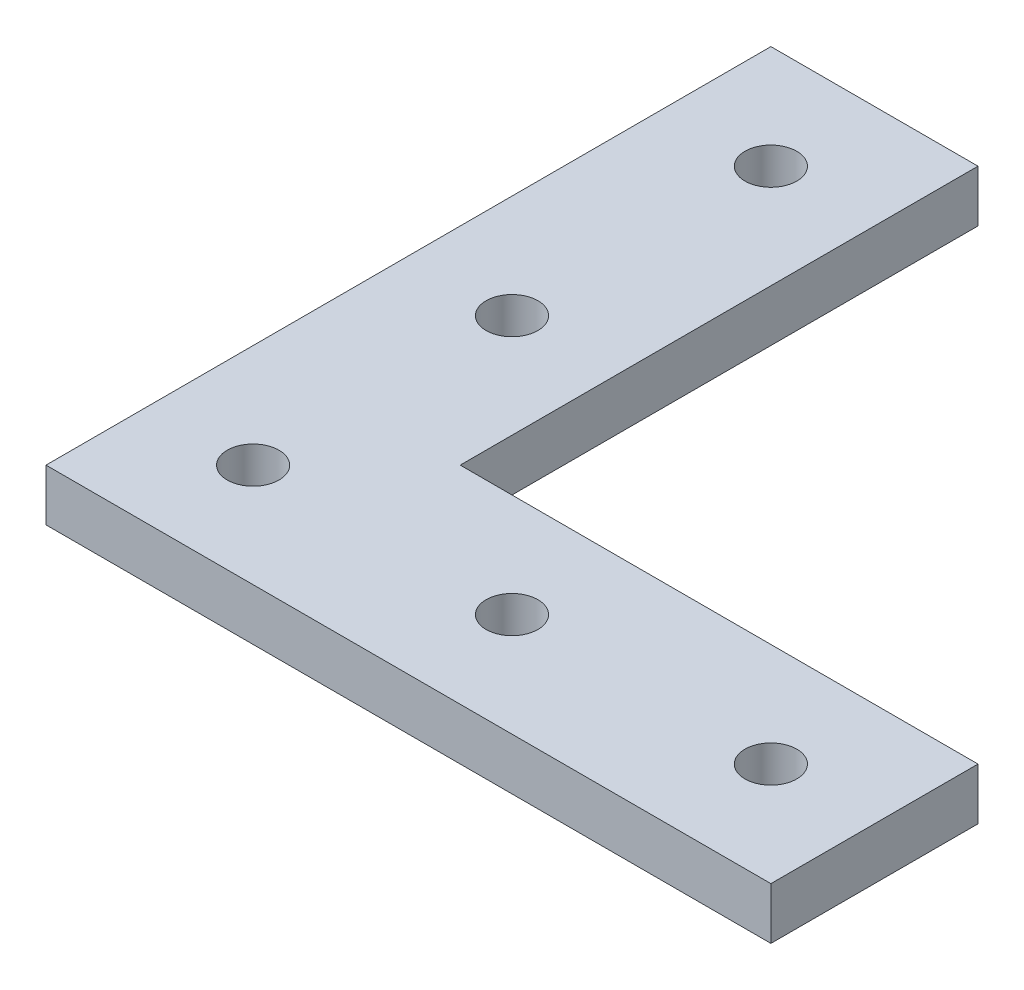
ISO-10303-21;
HEADER;
FILE_DESCRIPTION(('STEP AP214'),'2;1');
FILE_NAME('part.step','',(''),(''),'','','');
FILE_SCHEMA(('AUTOMOTIVE_DESIGN { 1 0 10303 214 1 1 1 1 }'));
ENDSEC;
DATA;
#1=APPLICATION_CONTEXT('core data for automotive mechanical design processes');
#2=APPLICATION_PROTOCOL_DEFINITION('international standard','automotive_design',2000,#1);
#3=PRODUCT_CONTEXT('',#1,'mechanical');
#4=PRODUCT('Part','Part','',(#3));
#5=PRODUCT_RELATED_PRODUCT_CATEGORY('part','',(#4));
#6=PRODUCT_DEFINITION_FORMATION('','',#4);
#7=PRODUCT_DEFINITION_CONTEXT('part definition',#1,'design');
#8=PRODUCT_DEFINITION('design','',#6,#7);
#9=PRODUCT_DEFINITION_SHAPE('','',#8);
#10=(LENGTH_UNIT() NAMED_UNIT(*) SI_UNIT(.MILLI.,.METRE.));
#11=(NAMED_UNIT(*) PLANE_ANGLE_UNIT() SI_UNIT($,.RADIAN.));
#12=(NAMED_UNIT(*) SI_UNIT($,.STERADIAN.) SOLID_ANGLE_UNIT());
#13=UNCERTAINTY_MEASURE_WITH_UNIT(LENGTH_MEASURE(1.E-05),#10,'distance_accuracy_value','');
#14=(GEOMETRIC_REPRESENTATION_CONTEXT(3) GLOBAL_UNCERTAINTY_ASSIGNED_CONTEXT((#13)) GLOBAL_UNIT_ASSIGNED_CONTEXT((#10,
#11,#12)) REPRESENTATION_CONTEXT('',''));
#15=CARTESIAN_POINT('',(0.,0.,0.));
#16=DIRECTION('',(0.,0.,1.));
#17=DIRECTION('',(1.,0.,0.));
#18=AXIS2_PLACEMENT_3D('',#15,#16,#17);
#19=CARTESIAN_POINT('',(70.,5.,0.));
#20=DIRECTION('',(0.,0.,-1.));
#21=DIRECTION('',(-1.,0.,0.));
#22=AXIS2_PLACEMENT_3D('',#19,#20,#21);
#23=PLANE('',#22);
#24=DIRECTION('',(1.,0.,0.));
#25=VECTOR('',#24,1.);
#26=CARTESIAN_POINT('',(70.,0.,0.));
#27=LINE('',#26,#25);
#28=CARTESIAN_POINT('',(0.,0.,0.));
#29=VERTEX_POINT('',#28);
#30=CARTESIAN_POINT('',(70.,0.,0.));
#31=VERTEX_POINT('',#30);
#32=EDGE_CURVE('E128',#29,#31,#27,.T.);
#33=ORIENTED_EDGE('',*,*,#32,.T.);
#34=DIRECTION('',(0.,-1.,0.));
#35=VECTOR('',#34,1.);
#36=CARTESIAN_POINT('',(70.,5.,0.));
#37=LINE('',#36,#35);
#38=CARTESIAN_POINT('',(70.,5.,0.));
#39=VERTEX_POINT('',#38);
#40=EDGE_CURVE('E11',#39,#31,#37,.T.);
#41=ORIENTED_EDGE('',*,*,#40,.F.);
#42=DIRECTION('',(1.,0.,0.));
#43=VECTOR('',#42,1.);
#44=CARTESIAN_POINT('',(70.,5.,0.));
#45=LINE('',#44,#43);
#46=CARTESIAN_POINT('',(0.,5.,0.));
#47=VERTEX_POINT('',#46);
#48=EDGE_CURVE('E145',#47,#39,#45,.T.);
#49=ORIENTED_EDGE('',*,*,#48,.F.);
#50=DIRECTION('',(0.,-1.,0.));
#51=VECTOR('',#50,1.);
#52=CARTESIAN_POINT('',(0.,5.,0.));
#53=LINE('',#52,#51);
#54=EDGE_CURVE('E124',#47,#29,#53,.T.);
#55=ORIENTED_EDGE('',*,*,#54,.T.);
#56=EDGE_LOOP('',(#33,#41,#49,#55));
#57=FACE_BOUND('',#56,.T.);
#58=ADVANCED_FACE('F39',(#57),#23,.F.);
#59=CARTESIAN_POINT('',(70.,5.,-20.));
#60=DIRECTION('',(-1.,0.,0.));
#61=DIRECTION('',(0.,0.,1.));
#62=AXIS2_PLACEMENT_3D('',#59,#60,#61);
#63=PLANE('',#62);
#64=DIRECTION('',(0.,0.,-1.));
#65=VECTOR('',#64,1.);
#66=CARTESIAN_POINT('',(70.,0.,-20.));
#67=LINE('',#66,#65);
#68=CARTESIAN_POINT('',(70.,0.,-20.));
#69=VERTEX_POINT('',#68);
#70=EDGE_CURVE('E132',#31,#69,#67,.T.);
#71=ORIENTED_EDGE('',*,*,#70,.T.);
#72=DIRECTION('',(0.,-1.,0.));
#73=VECTOR('',#72,1.);
#74=CARTESIAN_POINT('',(70.,5.,-20.));
#75=LINE('',#74,#73);
#76=CARTESIAN_POINT('',(70.,5.,-20.));
#77=VERTEX_POINT('',#76);
#78=EDGE_CURVE('E48',#77,#69,#75,.T.);
#79=ORIENTED_EDGE('',*,*,#78,.F.);
#80=DIRECTION('',(0.,0.,-1.));
#81=VECTOR('',#80,1.);
#82=CARTESIAN_POINT('',(70.,5.,-20.));
#83=LINE('',#82,#81);
#84=EDGE_CURVE('E93',#39,#77,#83,.T.);
#85=ORIENTED_EDGE('',*,*,#84,.F.);
#86=ORIENTED_EDGE('',*,*,#40,.T.);
#87=EDGE_LOOP('',(#71,#79,#85,#86));
#88=FACE_BOUND('',#87,.T.);
#89=ADVANCED_FACE('F174',(#88),#63,.F.);
#90=CARTESIAN_POINT('',(20.,5.,-20.));
#91=DIRECTION('',(0.,0.,1.));
#92=DIRECTION('',(1.,0.,0.));
#93=AXIS2_PLACEMENT_3D('',#90,#91,#92);
#94=PLANE('',#93);
#95=DIRECTION('',(-1.,0.,0.));
#96=VECTOR('',#95,1.);
#97=CARTESIAN_POINT('',(20.,0.,-20.));
#98=LINE('',#97,#96);
#99=CARTESIAN_POINT('',(20.,0.,-20.));
#100=VERTEX_POINT('',#99);
#101=EDGE_CURVE('E136',#69,#100,#98,.T.);
#102=ORIENTED_EDGE('',*,*,#101,.T.);
#103=DIRECTION('',(0.,-1.,0.));
#104=VECTOR('',#103,1.);
#105=CARTESIAN_POINT('',(20.,5.,-20.));
#106=LINE('',#105,#104);
#107=CARTESIAN_POINT('',(20.,5.,-20.));
#108=VERTEX_POINT('',#107);
#109=EDGE_CURVE('E117',#108,#100,#106,.T.);
#110=ORIENTED_EDGE('',*,*,#109,.F.);
#111=DIRECTION('',(-1.,0.,0.));
#112=VECTOR('',#111,1.);
#113=CARTESIAN_POINT('',(20.,5.,-20.));
#114=LINE('',#113,#112);
#115=EDGE_CURVE('E106',#77,#108,#114,.T.);
#116=ORIENTED_EDGE('',*,*,#115,.F.);
#117=ORIENTED_EDGE('',*,*,#78,.T.);
#118=EDGE_LOOP('',(#102,#110,#116,#117));
#119=FACE_BOUND('',#118,.T.);
#120=ADVANCED_FACE('F155',(#119),#94,.F.);
#121=CARTESIAN_POINT('',(20.,5.,-70.));
#122=DIRECTION('',(-1.,0.,0.));
#123=DIRECTION('',(0.,0.,1.));
#124=AXIS2_PLACEMENT_3D('',#121,#122,#123);
#125=PLANE('',#124);
#126=DIRECTION('',(0.,0.,-1.));
#127=VECTOR('',#126,1.);
#128=CARTESIAN_POINT('',(20.,0.,-70.));
#129=LINE('',#128,#127);
#130=CARTESIAN_POINT('',(20.,0.,-70.));
#131=VERTEX_POINT('',#130);
#132=EDGE_CURVE('E115',#100,#131,#129,.T.);
#133=ORIENTED_EDGE('',*,*,#132,.T.);
#134=DIRECTION('',(0.,-1.,0.));
#135=VECTOR('',#134,1.);
#136=CARTESIAN_POINT('',(20.,5.,-70.));
#137=LINE('',#136,#135);
#138=CARTESIAN_POINT('',(20.,5.,-70.));
#139=VERTEX_POINT('',#138);
#140=EDGE_CURVE('E112',#139,#131,#137,.T.);
#141=ORIENTED_EDGE('',*,*,#140,.F.);
#142=DIRECTION('',(0.,0.,-1.));
#143=VECTOR('',#142,1.);
#144=CARTESIAN_POINT('',(20.,5.,-70.));
#145=LINE('',#144,#143);
#146=EDGE_CURVE('E100',#108,#139,#145,.T.);
#147=ORIENTED_EDGE('',*,*,#146,.F.);
#148=ORIENTED_EDGE('',*,*,#109,.T.);
#149=EDGE_LOOP('',(#133,#141,#147,#148));
#150=FACE_BOUND('',#149,.T.);
#151=ADVANCED_FACE('F113',(#150),#125,.F.);
#152=CARTESIAN_POINT('',(0.,5.,-70.));
#153=DIRECTION('',(0.,0.,1.));
#154=DIRECTION('',(1.,0.,0.));
#155=AXIS2_PLACEMENT_3D('',#152,#153,#154);
#156=PLANE('',#155);
#157=DIRECTION('',(-1.,0.,0.));
#158=VECTOR('',#157,1.);
#159=CARTESIAN_POINT('',(0.,0.,-70.));
#160=LINE('',#159,#158);
#161=CARTESIAN_POINT('',(0.,0.,-70.));
#162=VERTEX_POINT('',#161);
#163=EDGE_CURVE('E79',#131,#162,#160,.T.);
#164=ORIENTED_EDGE('',*,*,#163,.T.);
#165=DIRECTION('',(0.,-1.,0.));
#166=VECTOR('',#165,1.);
#167=CARTESIAN_POINT('',(0.,5.,-70.));
#168=LINE('',#167,#166);
#169=CARTESIAN_POINT('',(0.,5.,-70.));
#170=VERTEX_POINT('',#169);
#171=EDGE_CURVE('E118',#170,#162,#168,.T.);
#172=ORIENTED_EDGE('',*,*,#171,.F.);
#173=DIRECTION('',(-1.,0.,0.));
#174=VECTOR('',#173,1.);
#175=CARTESIAN_POINT('',(0.,5.,-70.));
#176=LINE('',#175,#174);
#177=EDGE_CURVE('E104',#139,#170,#176,.T.);
#178=ORIENTED_EDGE('',*,*,#177,.F.);
#179=ORIENTED_EDGE('',*,*,#140,.T.);
#180=EDGE_LOOP('',(#164,#172,#178,#179));
#181=FACE_BOUND('',#180,.T.);
#182=ADVANCED_FACE('F120',(#181),#156,.F.);
#183=CARTESIAN_POINT('',(0.,5.,0.));
#184=DIRECTION('',(1.,0.,0.));
#185=DIRECTION('',(0.,0.,-1.));
#186=AXIS2_PLACEMENT_3D('',#183,#184,#185);
#187=PLANE('',#186);
#188=DIRECTION('',(0.,0.,1.));
#189=VECTOR('',#188,1.);
#190=CARTESIAN_POINT('',(0.,0.,0.));
#191=LINE('',#190,#189);
#192=EDGE_CURVE('E85',#162,#29,#191,.T.);
#193=ORIENTED_EDGE('',*,*,#192,.T.);
#194=ORIENTED_EDGE('',*,*,#54,.F.);
#195=DIRECTION('',(0.,0.,1.));
#196=VECTOR('',#195,1.);
#197=CARTESIAN_POINT('',(0.,5.,0.));
#198=LINE('',#197,#196);
#199=EDGE_CURVE('E56',#170,#47,#198,.T.);
#200=ORIENTED_EDGE('',*,*,#199,.F.);
#201=ORIENTED_EDGE('',*,*,#171,.T.);
#202=EDGE_LOOP('',(#193,#194,#200,#201));
#203=FACE_BOUND('',#202,.T.);
#204=ADVANCED_FACE('F162',(#203),#187,.F.);
#205=CARTESIAN_POINT('',(0.,5.,0.));
#206=DIRECTION('',(0.,-1.,0.));
#207=DIRECTION('',(0.,0.,-1.));
#208=AXIS2_PLACEMENT_3D('',#205,#206,#207);
#209=PLANE('',#208);
#210=CARTESIAN_POINT('',(10.,5.,-60.));
#211=DIRECTION('',(0.,1.,0.));
#212=DIRECTION('',(0.,0.,1.));
#213=AXIS2_PLACEMENT_3D('',#210,#211,#212);
#214=CIRCLE('',#213,2.5);
#215=CARTESIAN_POINT('',(10.,5.,-57.5));
#216=VERTEX_POINT('',#215);
#217=EDGE_CURVE('E269',#216,#216,#214,.T.);
#218=ORIENTED_EDGE('',*,*,#217,.F.);
#219=EDGE_LOOP('',(#218));
#220=FACE_BOUND('',#219,.T.);
#221=CARTESIAN_POINT('',(10.,5.,-35.));
#222=DIRECTION('',(0.,1.,0.));
#223=DIRECTION('',(0.,0.,1.));
#224=AXIS2_PLACEMENT_3D('',#221,#222,#223);
#225=CIRCLE('',#224,2.5);
#226=CARTESIAN_POINT('',(10.,5.,-32.5));
#227=VERTEX_POINT('',#226);
#228=EDGE_CURVE('E277',#227,#227,#225,.T.);
#229=ORIENTED_EDGE('',*,*,#228,.F.);
#230=EDGE_LOOP('',(#229));
#231=FACE_BOUND('',#230,.T.);
#232=CARTESIAN_POINT('',(10.,5.,-10.));
#233=DIRECTION('',(0.,1.,0.));
#234=DIRECTION('',(0.,0.,1.));
#235=AXIS2_PLACEMENT_3D('',#232,#233,#234);
#236=CIRCLE('',#235,2.5);
#237=CARTESIAN_POINT('',(10.,5.,-7.5));
#238=VERTEX_POINT('',#237);
#239=EDGE_CURVE('E287',#238,#238,#236,.T.);
#240=ORIENTED_EDGE('',*,*,#239,.F.);
#241=EDGE_LOOP('',(#240));
#242=FACE_BOUND('',#241,.T.);
#243=CARTESIAN_POINT('',(35.,5.,-10.));
#244=DIRECTION('',(0.,1.,0.));
#245=DIRECTION('',(0.,0.,1.));
#246=AXIS2_PLACEMENT_3D('',#243,#244,#245);
#247=CIRCLE('',#246,2.5);
#248=CARTESIAN_POINT('',(35.,5.,-7.5));
#249=VERTEX_POINT('',#248);
#250=EDGE_CURVE('E295',#249,#249,#247,.T.);
#251=ORIENTED_EDGE('',*,*,#250,.F.);
#252=EDGE_LOOP('',(#251));
#253=FACE_BOUND('',#252,.T.);
#254=CARTESIAN_POINT('',(60.,5.,-10.));
#255=DIRECTION('',(0.,1.,0.));
#256=DIRECTION('',(0.,0.,1.));
#257=AXIS2_PLACEMENT_3D('',#254,#255,#256);
#258=CIRCLE('',#257,2.49999999999999);
#259=CARTESIAN_POINT('',(60.,5.,-7.50000000000001));
#260=VERTEX_POINT('',#259);
#261=EDGE_CURVE('E303',#260,#260,#258,.T.);
#262=ORIENTED_EDGE('',*,*,#261,.F.);
#263=EDGE_LOOP('',(#262));
#264=FACE_BOUND('',#263,.T.);
#265=ORIENTED_EDGE('',*,*,#48,.T.);
#266=ORIENTED_EDGE('',*,*,#84,.T.);
#267=ORIENTED_EDGE('',*,*,#115,.T.);
#268=ORIENTED_EDGE('',*,*,#146,.T.);
#269=ORIENTED_EDGE('',*,*,#177,.T.);
#270=ORIENTED_EDGE('',*,*,#199,.T.);
#271=EDGE_LOOP('',(#265,#266,#267,#268,#269,#270));
#272=FACE_BOUND('',#271,.T.);
#273=ADVANCED_FACE('F102',(#220,#231,#242,#253,#264,#272),#209,.F.);
#274=CARTESIAN_POINT('',(0.,0.,0.));
#275=DIRECTION('',(0.,-1.,0.));
#276=DIRECTION('',(0.,0.,-1.));
#277=AXIS2_PLACEMENT_3D('',#274,#275,#276);
#278=PLANE('',#277);
#279=CARTESIAN_POINT('',(10.,0.,-60.));
#280=DIRECTION('',(0.,1.,0.));
#281=DIRECTION('',(0.,0.,1.));
#282=AXIS2_PLACEMENT_3D('',#279,#280,#281);
#283=CIRCLE('',#282,2.5);
#284=CARTESIAN_POINT('',(10.,0.,-57.5));
#285=VERTEX_POINT('',#284);
#286=EDGE_CURVE('E133',#285,#285,#283,.T.);
#287=ORIENTED_EDGE('',*,*,#286,.T.);
#288=EDGE_LOOP('',(#287));
#289=FACE_BOUND('',#288,.T.);
#290=CARTESIAN_POINT('',(10.,0.,-35.));
#291=DIRECTION('',(0.,1.,0.));
#292=DIRECTION('',(0.,0.,1.));
#293=AXIS2_PLACEMENT_3D('',#290,#291,#292);
#294=CIRCLE('',#293,2.5);
#295=CARTESIAN_POINT('',(10.,0.,-32.5));
#296=VERTEX_POINT('',#295);
#297=EDGE_CURVE('E271',#296,#296,#294,.T.);
#298=ORIENTED_EDGE('',*,*,#297,.T.);
#299=EDGE_LOOP('',(#298));
#300=FACE_BOUND('',#299,.T.);
#301=CARTESIAN_POINT('',(10.,0.,-10.));
#302=DIRECTION('',(0.,1.,0.));
#303=DIRECTION('',(0.,0.,1.));
#304=AXIS2_PLACEMENT_3D('',#301,#302,#303);
#305=CIRCLE('',#304,2.5);
#306=CARTESIAN_POINT('',(10.,0.,-7.5));
#307=VERTEX_POINT('',#306);
#308=EDGE_CURVE('E283',#307,#307,#305,.T.);
#309=ORIENTED_EDGE('',*,*,#308,.T.);
#310=EDGE_LOOP('',(#309));
#311=FACE_BOUND('',#310,.T.);
#312=CARTESIAN_POINT('',(35.,0.,-10.));
#313=DIRECTION('',(0.,1.,0.));
#314=DIRECTION('',(0.,0.,1.));
#315=AXIS2_PLACEMENT_3D('',#312,#313,#314);
#316=CIRCLE('',#315,2.5);
#317=CARTESIAN_POINT('',(35.,0.,-7.5));
#318=VERTEX_POINT('',#317);
#319=EDGE_CURVE('E291',#318,#318,#316,.T.);
#320=ORIENTED_EDGE('',*,*,#319,.T.);
#321=EDGE_LOOP('',(#320));
#322=FACE_BOUND('',#321,.T.);
#323=CARTESIAN_POINT('',(60.,0.,-10.));
#324=DIRECTION('',(0.,1.,0.));
#325=DIRECTION('',(0.,0.,1.));
#326=AXIS2_PLACEMENT_3D('',#323,#324,#325);
#327=CIRCLE('',#326,2.49999999999999);
#328=CARTESIAN_POINT('',(60.,0.,-7.50000000000001));
#329=VERTEX_POINT('',#328);
#330=EDGE_CURVE('E299',#329,#329,#327,.T.);
#331=ORIENTED_EDGE('',*,*,#330,.T.);
#332=EDGE_LOOP('',(#331));
#333=FACE_BOUND('',#332,.T.);
#334=ORIENTED_EDGE('',*,*,#32,.F.);
#335=ORIENTED_EDGE('',*,*,#192,.F.);
#336=ORIENTED_EDGE('',*,*,#163,.F.);
#337=ORIENTED_EDGE('',*,*,#132,.F.);
#338=ORIENTED_EDGE('',*,*,#101,.F.);
#339=ORIENTED_EDGE('',*,*,#70,.F.);
#340=EDGE_LOOP('',(#334,#335,#336,#337,#338,#339));
#341=FACE_BOUND('',#340,.T.);
#342=ADVANCED_FACE('F158',(#289,#300,#311,#322,#333,#341),#278,.T.);
#343=CARTESIAN_POINT('',(60.,0.,-10.));
#344=DIRECTION('',(0.,1.,0.));
#345=DIRECTION('',(0.,0.,1.));
#346=AXIS2_PLACEMENT_3D('',#343,#344,#345);
#347=CYLINDRICAL_SURFACE('',#346,2.49999999999999);
#348=ORIENTED_EDGE('',*,*,#330,.F.);
#349=EDGE_LOOP('',(#348));
#350=FACE_BOUND('',#349,.T.);
#351=ORIENTED_EDGE('',*,*,#261,.T.);
#352=EDGE_LOOP('',(#351));
#353=FACE_BOUND('',#352,.T.);
#354=ADVANCED_FACE('F211',(#350,#353),#347,.F.);
#355=CARTESIAN_POINT('',(35.,0.,-10.));
#356=DIRECTION('',(0.,1.,0.));
#357=DIRECTION('',(0.,0.,1.));
#358=AXIS2_PLACEMENT_3D('',#355,#356,#357);
#359=CYLINDRICAL_SURFACE('',#358,2.5);
#360=ORIENTED_EDGE('',*,*,#319,.F.);
#361=EDGE_LOOP('',(#360));
#362=FACE_BOUND('',#361,.T.);
#363=ORIENTED_EDGE('',*,*,#250,.T.);
#364=EDGE_LOOP('',(#363));
#365=FACE_BOUND('',#364,.T.);
#366=ADVANCED_FACE('F220',(#362,#365),#359,.F.);
#367=CARTESIAN_POINT('',(10.,0.,-10.));
#368=DIRECTION('',(0.,1.,0.));
#369=DIRECTION('',(0.,0.,1.));
#370=AXIS2_PLACEMENT_3D('',#367,#368,#369);
#371=CYLINDRICAL_SURFACE('',#370,2.5);
#372=ORIENTED_EDGE('',*,*,#308,.F.);
#373=EDGE_LOOP('',(#372));
#374=FACE_BOUND('',#373,.T.);
#375=ORIENTED_EDGE('',*,*,#239,.T.);
#376=EDGE_LOOP('',(#375));
#377=FACE_BOUND('',#376,.T.);
#378=ADVANCED_FACE('F230',(#374,#377),#371,.F.);
#379=CARTESIAN_POINT('',(10.,0.,-35.));
#380=DIRECTION('',(0.,1.,0.));
#381=DIRECTION('',(0.,0.,1.));
#382=AXIS2_PLACEMENT_3D('',#379,#380,#381);
#383=CYLINDRICAL_SURFACE('',#382,2.5);
#384=ORIENTED_EDGE('',*,*,#297,.F.);
#385=EDGE_LOOP('',(#384));
#386=FACE_BOUND('',#385,.T.);
#387=ORIENTED_EDGE('',*,*,#228,.T.);
#388=EDGE_LOOP('',(#387));
#389=FACE_BOUND('',#388,.T.);
#390=ADVANCED_FACE('F240',(#386,#389),#383,.F.);
#391=CARTESIAN_POINT('',(10.,0.,-60.));
#392=DIRECTION('',(0.,1.,0.));
#393=DIRECTION('',(0.,0.,1.));
#394=AXIS2_PLACEMENT_3D('',#391,#392,#393);
#395=CYLINDRICAL_SURFACE('',#394,2.5);
#396=ORIENTED_EDGE('',*,*,#286,.F.);
#397=EDGE_LOOP('',(#396));
#398=FACE_BOUND('',#397,.T.);
#399=ORIENTED_EDGE('',*,*,#217,.T.);
#400=EDGE_LOOP('',(#399));
#401=FACE_BOUND('',#400,.T.);
#402=ADVANCED_FACE('F250',(#398,#401),#395,.F.);
#403=CLOSED_SHELL('',(#58,#89,#120,#151,#182,#204,#273,#342,#354,#366,#378,#390,#402));
#404=MANIFOLD_SOLID_BREP('B2',#403);
#405=ADVANCED_BREP_SHAPE_REPRESENTATION('',(#18,#404),#14);
#406=SHAPE_DEFINITION_REPRESENTATION(#9,#405);
ENDSEC;
END-ISO-10303-21;
